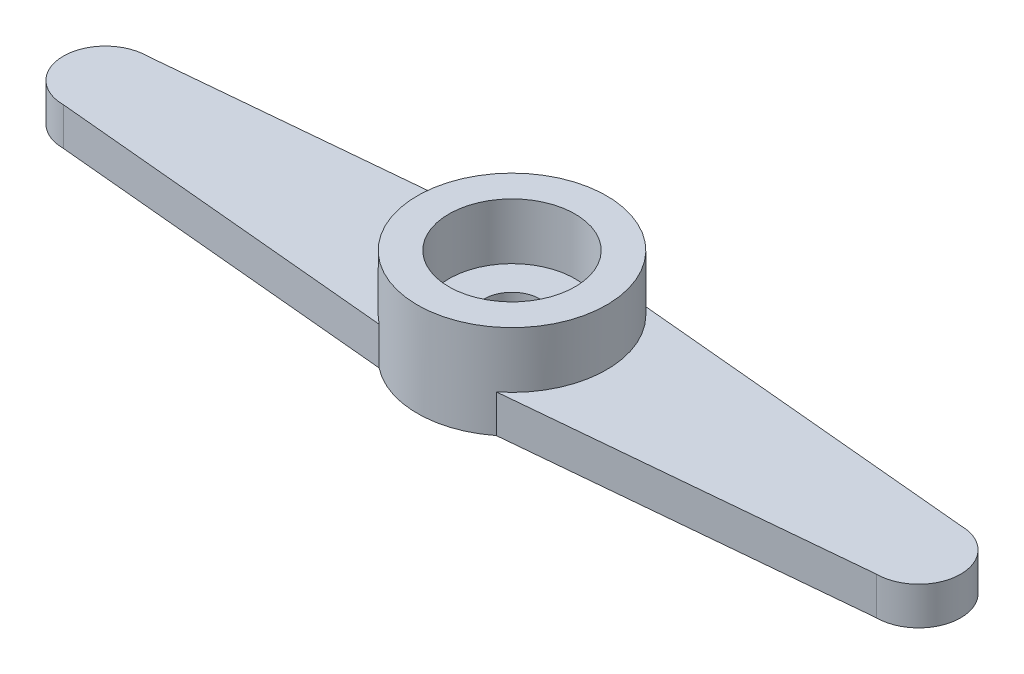
ISO-10303-21;
HEADER;
FILE_DESCRIPTION(('STEP AP214'),'2;1');
FILE_NAME('part.step','',(''),(''),'','','');
FILE_SCHEMA(('AUTOMOTIVE_DESIGN { 1 0 10303 214 1 1 1 1 }'));
ENDSEC;
DATA;
#1=APPLICATION_CONTEXT('core data for automotive mechanical design processes');
#2=APPLICATION_PROTOCOL_DEFINITION('international standard','automotive_design',2000,#1);
#3=PRODUCT_CONTEXT('',#1,'mechanical');
#4=PRODUCT('Part','Part','',(#3));
#5=PRODUCT_RELATED_PRODUCT_CATEGORY('part','',(#4));
#6=PRODUCT_DEFINITION_FORMATION('','',#4);
#7=PRODUCT_DEFINITION_CONTEXT('part definition',#1,'design');
#8=PRODUCT_DEFINITION('design','',#6,#7);
#9=PRODUCT_DEFINITION_SHAPE('','',#8);
#10=(LENGTH_UNIT() NAMED_UNIT(*) SI_UNIT(.MILLI.,.METRE.));
#11=(NAMED_UNIT(*) PLANE_ANGLE_UNIT() SI_UNIT($,.RADIAN.));
#12=(NAMED_UNIT(*) SI_UNIT($,.STERADIAN.) SOLID_ANGLE_UNIT());
#13=UNCERTAINTY_MEASURE_WITH_UNIT(LENGTH_MEASURE(1.E-05),#10,'distance_accuracy_value','');
#14=(GEOMETRIC_REPRESENTATION_CONTEXT(3) GLOBAL_UNCERTAINTY_ASSIGNED_CONTEXT((#13)) GLOBAL_UNIT_ASSIGNED_CONTEXT((#10,
#11,#12)) REPRESENTATION_CONTEXT('',''));
#15=CARTESIAN_POINT('',(0.,0.,0.));
#16=DIRECTION('',(0.,0.,1.));
#17=DIRECTION('',(1.,0.,0.));
#18=AXIS2_PLACEMENT_3D('',#15,#16,#17);
#19=CARTESIAN_POINT('',(0.,1.35,0.));
#20=DIRECTION('',(0.,1.,0.));
#21=DIRECTION('',(0.,0.,1.));
#22=AXIS2_PLACEMENT_3D('',#19,#20,#21);
#23=PLANE('',#22);
#24=CARTESIAN_POINT('',(0.,1.35,0.));
#25=DIRECTION('',(0.,1.,0.));
#26=DIRECTION('',(0.,0.,1.));
#27=AXIS2_PLACEMENT_3D('',#24,#25,#26);
#28=CIRCLE('',#27,3.375);
#29=CARTESIAN_POINT('',(2.09000598085269,1.35,2.65));
#30=VERTEX_POINT('',#29);
#31=CARTESIAN_POINT('',(2.09000598085269,1.35,-2.65));
#32=VERTEX_POINT('',#31);
#33=EDGE_CURVE('E50',#30,#32,#28,.T.);
#34=ORIENTED_EDGE('',*,*,#33,.F.);
#35=DIRECTION('',(0.995733846741475,0.,-0.0922719158434676));
#36=VECTOR('',#35,1.);
#37=CARTESIAN_POINT('',(0.26127194813818,1.35,2.81946375110068));
#38=LINE('',#37,#36);
#39=CARTESIAN_POINT('',(14.5,1.35,1.5));
#40=VERTEX_POINT('',#39);
#41=EDGE_CURVE('E128',#30,#40,#38,.T.);
#42=ORIENTED_EDGE('',*,*,#41,.T.);
#43=CARTESIAN_POINT('',(14.5,1.35,0.));
#44=DIRECTION('',(0.,1.,0.));
#45=DIRECTION('',(0.,0.,1.));
#46=AXIS2_PLACEMENT_3D('',#43,#44,#45);
#47=CIRCLE('',#46,1.5);
#48=CARTESIAN_POINT('',(14.5,1.35,-1.5));
#49=VERTEX_POINT('',#48);
#50=EDGE_CURVE('E114',#49,#40,#47,.F.);
#51=ORIENTED_EDGE('',*,*,#50,.F.);
#52=DIRECTION('',(0.995733846741475,0.,0.0922719158434676));
#53=VECTOR('',#52,1.);
#54=CARTESIAN_POINT('',(0.26127194813818,1.35,-2.81946375110068));
#55=LINE('',#54,#53);
#56=EDGE_CURVE('E126',#32,#49,#55,.T.);
#57=ORIENTED_EDGE('',*,*,#56,.F.);
#58=EDGE_LOOP('',(#34,#42,#51,#57));
#59=FACE_BOUND('',#58,.T.);
#60=ADVANCED_FACE('F39',(#59),#23,.T.);
#61=CARTESIAN_POINT('',(-0.26127194813818,1.35,-2.81946375110068));
#62=DIRECTION('',(0.0922719158434675,0.,0.995733846741475));
#63=DIRECTION('',(0.995733846741475,0.,-0.0922719158434676));
#64=AXIS2_PLACEMENT_3D('',#61,#62,#63);
#65=PLANE('',#64);
#66=DIRECTION('',(-0.995733846741475,0.,0.0922719158434676));
#67=VECTOR('',#66,1.);
#68=CARTESIAN_POINT('',(-0.26127194813818,0.,-2.81946375110068));
#69=LINE('',#68,#67);
#70=CARTESIAN_POINT('',(-2.09000598085269,0.,-2.65));
#71=VERTEX_POINT('',#70);
#72=CARTESIAN_POINT('',(-14.5,0.,-1.5));
#73=VERTEX_POINT('',#72);
#74=EDGE_CURVE('E137',#71,#73,#69,.T.);
#75=ORIENTED_EDGE('',*,*,#74,.T.);
#76=DIRECTION('',(0.,-1.,0.));
#77=VECTOR('',#76,1.);
#78=CARTESIAN_POINT('',(-14.5,1.35,-1.5));
#79=LINE('',#78,#77);
#80=CARTESIAN_POINT('',(-14.5,1.35,-1.5));
#81=VERTEX_POINT('',#80);
#82=EDGE_CURVE('E43',#81,#73,#79,.T.);
#83=ORIENTED_EDGE('',*,*,#82,.F.);
#84=DIRECTION('',(-0.995733846741475,0.,0.0922719158434676));
#85=VECTOR('',#84,1.);
#86=CARTESIAN_POINT('',(-0.26127194813818,1.35,-2.81946375110068));
#87=LINE('',#86,#85);
#88=CARTESIAN_POINT('',(-2.09000598085269,1.35,-2.65));
#89=VERTEX_POINT('',#88);
#90=EDGE_CURVE('E180',#89,#81,#87,.T.);
#91=ORIENTED_EDGE('',*,*,#90,.F.);
#92=DIRECTION('',(0.,-1.,0.));
#93=VECTOR('',#92,1.);
#94=CARTESIAN_POINT('',(-2.09000598085269,1.35,-2.65));
#95=LINE('',#94,#93);
#96=EDGE_CURVE('E132',#89,#71,#95,.T.);
#97=ORIENTED_EDGE('',*,*,#96,.T.);
#98=EDGE_LOOP('',(#75,#83,#91,#97));
#99=FACE_BOUND('',#98,.T.);
#100=ADVANCED_FACE('F41',(#99),#65,.F.);
#101=CARTESIAN_POINT('',(-14.5,1.35,0.));
#102=DIRECTION('',(0.,-1.,0.));
#103=DIRECTION('',(0.,0.,-1.));
#104=AXIS2_PLACEMENT_3D('',#101,#102,#103);
#105=CYLINDRICAL_SURFACE('',#104,1.5);
#106=CARTESIAN_POINT('',(-14.5,0.,0.));
#107=DIRECTION('',(0.,1.,0.));
#108=DIRECTION('',(0.,0.,1.));
#109=AXIS2_PLACEMENT_3D('',#106,#107,#108);
#110=CIRCLE('',#109,1.5);
#111=CARTESIAN_POINT('',(-14.5,0.,1.5));
#112=VERTEX_POINT('',#111);
#113=EDGE_CURVE('E140',#73,#112,#110,.T.);
#114=ORIENTED_EDGE('',*,*,#113,.T.);
#115=DIRECTION('',(0.,-1.,0.));
#116=VECTOR('',#115,1.);
#117=CARTESIAN_POINT('',(-14.5,1.35,1.5));
#118=LINE('',#117,#116);
#119=CARTESIAN_POINT('',(-14.5,1.35,1.5));
#120=VERTEX_POINT('',#119);
#121=EDGE_CURVE('E161',#120,#112,#118,.T.);
#122=ORIENTED_EDGE('',*,*,#121,.F.);
#123=CARTESIAN_POINT('',(-14.5,1.35,0.));
#124=DIRECTION('',(0.,1.,0.));
#125=DIRECTION('',(0.,0.,1.));
#126=AXIS2_PLACEMENT_3D('',#123,#124,#125);
#127=CIRCLE('',#126,1.5);
#128=EDGE_CURVE('E98',#81,#120,#127,.T.);
#129=ORIENTED_EDGE('',*,*,#128,.F.);
#130=ORIENTED_EDGE('',*,*,#82,.T.);
#131=EDGE_LOOP('',(#114,#122,#129,#130));
#132=FACE_BOUND('',#131,.T.);
#133=ADVANCED_FACE('F166',(#132),#105,.T.);
#134=CARTESIAN_POINT('',(-0.26127194813818,1.35,2.81946375110068));
#135=DIRECTION('',(-0.0922719158434675,0.,0.995733846741475));
#136=DIRECTION('',(0.995733846741475,0.,0.0922719158434676));
#137=AXIS2_PLACEMENT_3D('',#134,#135,#136);
#138=PLANE('',#137);
#139=DIRECTION('',(-0.995733846741475,0.,-0.0922719158434676));
#140=VECTOR('',#139,1.);
#141=CARTESIAN_POINT('',(-0.26127194813818,0.,2.81946375110068));
#142=LINE('',#141,#140);
#143=CARTESIAN_POINT('',(-2.09000598085269,0.,2.65));
#144=VERTEX_POINT('',#143);
#145=EDGE_CURVE('E144',#144,#112,#142,.T.);
#146=ORIENTED_EDGE('',*,*,#145,.F.);
#147=DIRECTION('',(0.,-1.,0.));
#148=VECTOR('',#147,1.);
#149=CARTESIAN_POINT('',(-2.09000598085269,1.35,2.65));
#150=LINE('',#149,#148);
#151=CARTESIAN_POINT('',(-2.09000598085269,1.35,2.65));
#152=VERTEX_POINT('',#151);
#153=EDGE_CURVE('E160',#152,#144,#150,.T.);
#154=ORIENTED_EDGE('',*,*,#153,.F.);
#155=DIRECTION('',(-0.995733846741475,0.,-0.0922719158434676));
#156=VECTOR('',#155,1.);
#157=CARTESIAN_POINT('',(-0.26127194813818,1.35,2.81946375110068));
#158=LINE('',#157,#156);
#159=EDGE_CURVE('E175',#152,#120,#158,.T.);
#160=ORIENTED_EDGE('',*,*,#159,.T.);
#161=ORIENTED_EDGE('',*,*,#121,.T.);
#162=EDGE_LOOP('',(#146,#154,#160,#161));
#163=FACE_BOUND('',#162,.T.);
#164=ADVANCED_FACE('F174',(#163),#138,.T.);
#165=CARTESIAN_POINT('',(0.26127194813818,1.35,2.81946375110068));
#166=DIRECTION('',(-0.0922719158434675,0.,-0.995733846741475));
#167=DIRECTION('',(-0.995733846741475,0.,0.0922719158434676));
#168=AXIS2_PLACEMENT_3D('',#165,#166,#167);
#169=PLANE('',#168);
#170=DIRECTION('',(0.995733846741475,0.,-0.0922719158434676));
#171=VECTOR('',#170,1.);
#172=CARTESIAN_POINT('',(0.26127194813818,0.,2.81946375110068));
#173=LINE('',#172,#171);
#174=CARTESIAN_POINT('',(2.09000598085269,0.,2.65));
#175=VERTEX_POINT('',#174);
#176=CARTESIAN_POINT('',(14.5,0.,1.5));
#177=VERTEX_POINT('',#176);
#178=EDGE_CURVE('E149',#175,#177,#173,.T.);
#179=ORIENTED_EDGE('',*,*,#178,.T.);
#180=DIRECTION('',(0.,-1.,0.));
#181=VECTOR('',#180,1.);
#182=CARTESIAN_POINT('',(14.5,1.35,1.5));
#183=LINE('',#182,#181);
#184=EDGE_CURVE('E121',#40,#177,#183,.T.);
#185=ORIENTED_EDGE('',*,*,#184,.F.);
#186=ORIENTED_EDGE('',*,*,#41,.F.);
#187=DIRECTION('',(0.,-1.,0.));
#188=VECTOR('',#187,1.);
#189=CARTESIAN_POINT('',(2.09000598085269,1.35,2.65));
#190=LINE('',#189,#188);
#191=EDGE_CURVE('E157',#30,#175,#190,.T.);
#192=ORIENTED_EDGE('',*,*,#191,.T.);
#193=EDGE_LOOP('',(#179,#185,#186,#192));
#194=FACE_BOUND('',#193,.T.);
#195=ADVANCED_FACE('F321',(#194),#169,.F.);
#196=CARTESIAN_POINT('',(14.5,1.35,0.));
#197=DIRECTION('',(0.,-1.,0.));
#198=DIRECTION('',(0.,0.,-1.));
#199=AXIS2_PLACEMENT_3D('',#196,#197,#198);
#200=CYLINDRICAL_SURFACE('',#199,1.5);
#201=CARTESIAN_POINT('',(14.5,0.,0.));
#202=DIRECTION('',(0.,1.,0.));
#203=DIRECTION('',(0.,0.,1.));
#204=AXIS2_PLACEMENT_3D('',#201,#202,#203);
#205=CIRCLE('',#204,1.5);
#206=CARTESIAN_POINT('',(14.5,0.,-1.5));
#207=VERTEX_POINT('',#206);
#208=EDGE_CURVE('E116',#207,#177,#205,.F.);
#209=ORIENTED_EDGE('',*,*,#208,.F.);
#210=DIRECTION('',(0.,-1.,0.));
#211=VECTOR('',#210,1.);
#212=CARTESIAN_POINT('',(14.5,1.35,-1.5));
#213=LINE('',#212,#211);
#214=EDGE_CURVE('E111',#49,#207,#213,.T.);
#215=ORIENTED_EDGE('',*,*,#214,.F.);
#216=ORIENTED_EDGE('',*,*,#50,.T.);
#217=ORIENTED_EDGE('',*,*,#184,.T.);
#218=EDGE_LOOP('',(#209,#215,#216,#217));
#219=FACE_BOUND('',#218,.T.);
#220=ADVANCED_FACE('F113',(#219),#200,.T.);
#221=CARTESIAN_POINT('',(0.26127194813818,1.35,-2.81946375110068));
#222=DIRECTION('',(0.0922719158434675,0.,-0.995733846741475));
#223=DIRECTION('',(-0.995733846741475,0.,-0.0922719158434676));
#224=AXIS2_PLACEMENT_3D('',#221,#222,#223);
#225=PLANE('',#224);
#226=DIRECTION('',(0.995733846741475,0.,0.0922719158434676));
#227=VECTOR('',#226,1.);
#228=CARTESIAN_POINT('',(0.26127194813818,0.,-2.81946375110068));
#229=LINE('',#228,#227);
#230=CARTESIAN_POINT('',(2.09000598085269,0.,-2.65));
#231=VERTEX_POINT('',#230);
#232=EDGE_CURVE('E153',#231,#207,#229,.T.);
#233=ORIENTED_EDGE('',*,*,#232,.F.);
#234=DIRECTION('',(0.,-1.,0.));
#235=VECTOR('',#234,1.);
#236=CARTESIAN_POINT('',(2.09000598085269,1.35,-2.65));
#237=LINE('',#236,#235);
#238=EDGE_CURVE('E86',#32,#231,#237,.T.);
#239=ORIENTED_EDGE('',*,*,#238,.F.);
#240=ORIENTED_EDGE('',*,*,#56,.T.);
#241=ORIENTED_EDGE('',*,*,#214,.T.);
#242=EDGE_LOOP('',(#233,#239,#240,#241));
#243=FACE_BOUND('',#242,.T.);
#244=ADVANCED_FACE('F131',(#243),#225,.T.);
#245=CARTESIAN_POINT('',(0.,1.35,0.));
#246=DIRECTION('',(0.,-1.,0.));
#247=DIRECTION('',(0.,0.,-1.));
#248=AXIS2_PLACEMENT_3D('',#245,#246,#247);
#249=CYLINDRICAL_SURFACE('',#248,3.375);
#250=CARTESIAN_POINT('',(0.,0.,0.));
#251=DIRECTION('',(0.,1.,0.));
#252=DIRECTION('',(0.,0.,1.));
#253=AXIS2_PLACEMENT_3D('',#250,#251,#252);
#254=CIRCLE('',#253,3.375);
#255=EDGE_CURVE('E89',#231,#71,#254,.T.);
#256=ORIENTED_EDGE('',*,*,#255,.T.);
#257=ORIENTED_EDGE('',*,*,#96,.F.);
#258=EDGE_CURVE('E11',#89,#152,#28,.T.);
#259=ORIENTED_EDGE('',*,*,#258,.T.);
#260=ORIENTED_EDGE('',*,*,#153,.T.);
#261=EDGE_CURVE('E147',#144,#175,#254,.T.);
#262=ORIENTED_EDGE('',*,*,#261,.T.);
#263=ORIENTED_EDGE('',*,*,#191,.F.);
#264=ORIENTED_EDGE('',*,*,#33,.T.);
#265=ORIENTED_EDGE('',*,*,#238,.T.);
#266=EDGE_LOOP('',(#256,#257,#259,#260,#262,#263,#264,#265));
#267=FACE_BOUND('',#266,.T.);
#268=CARTESIAN_POINT('',(0.,3.35,0.));
#269=DIRECTION('',(0.,1.,0.));
#270=DIRECTION('',(0.,0.,1.));
#271=AXIS2_PLACEMENT_3D('',#268,#269,#270);
#272=CIRCLE('',#271,3.375);
#273=CARTESIAN_POINT('',(0.,3.35,3.375));
#274=VERTEX_POINT('',#273);
#275=EDGE_CURVE('E141',#274,#274,#272,.T.);
#276=ORIENTED_EDGE('',*,*,#275,.F.);
#277=EDGE_LOOP('',(#276));
#278=FACE_BOUND('',#277,.T.);
#279=ADVANCED_FACE('F178',(#267,#278),#249,.T.);
#280=ORIENTED_EDGE('',*,*,#258,.F.);
#281=ORIENTED_EDGE('',*,*,#90,.T.);
#282=ORIENTED_EDGE('',*,*,#128,.T.);
#283=ORIENTED_EDGE('',*,*,#159,.F.);
#284=EDGE_LOOP('',(#280,#281,#282,#283));
#285=FACE_BOUND('',#284,.T.);
#286=ADVANCED_FACE('F176',(#285),#23,.T.);
#287=CARTESIAN_POINT('',(0.,0.,0.));
#288=DIRECTION('',(0.,1.,0.));
#289=DIRECTION('',(0.,0.,1.));
#290=AXIS2_PLACEMENT_3D('',#287,#288,#289);
#291=PLANE('',#290);
#292=CARTESIAN_POINT('',(0.,0.,0.));
#293=DIRECTION('',(0.,1.,0.));
#294=DIRECTION('',(0.,0.,1.));
#295=AXIS2_PLACEMENT_3D('',#292,#293,#294);
#296=CIRCLE('',#295,1.);
#297=CARTESIAN_POINT('',(0.,0.,1.));
#298=VERTEX_POINT('',#297);
#299=EDGE_CURVE('E190',#298,#298,#296,.T.);
#300=ORIENTED_EDGE('',*,*,#299,.T.);
#301=EDGE_LOOP('',(#300));
#302=FACE_BOUND('',#301,.T.);
#303=ORIENTED_EDGE('',*,*,#74,.F.);
#304=ORIENTED_EDGE('',*,*,#255,.F.);
#305=ORIENTED_EDGE('',*,*,#232,.T.);
#306=ORIENTED_EDGE('',*,*,#208,.T.);
#307=ORIENTED_EDGE('',*,*,#178,.F.);
#308=ORIENTED_EDGE('',*,*,#261,.F.);
#309=ORIENTED_EDGE('',*,*,#145,.T.);
#310=ORIENTED_EDGE('',*,*,#113,.F.);
#311=EDGE_LOOP('',(#303,#304,#305,#306,#307,#308,#309,#310));
#312=FACE_BOUND('',#311,.T.);
#313=ADVANCED_FACE('F171',(#302,#312),#291,.F.);
#314=CARTESIAN_POINT('',(0.,3.35,0.));
#315=DIRECTION('',(0.,1.,0.));
#316=DIRECTION('',(0.,0.,1.));
#317=AXIS2_PLACEMENT_3D('',#314,#315,#316);
#318=PLANE('',#317);
#319=CARTESIAN_POINT('',(0.,3.35,0.));
#320=DIRECTION('',(0.,1.,0.));
#321=DIRECTION('',(0.,0.,1.));
#322=AXIS2_PLACEMENT_3D('',#319,#320,#321);
#323=CIRCLE('',#322,2.25);
#324=CARTESIAN_POINT('',(0.,3.35,2.25));
#325=VERTEX_POINT('',#324);
#326=EDGE_CURVE('E187',#325,#325,#323,.T.);
#327=ORIENTED_EDGE('',*,*,#326,.F.);
#328=EDGE_LOOP('',(#327));
#329=FACE_BOUND('',#328,.T.);
#330=ORIENTED_EDGE('',*,*,#275,.T.);
#331=EDGE_LOOP('',(#330));
#332=FACE_BOUND('',#331,.T.);
#333=ADVANCED_FACE('F215',(#329,#332),#318,.T.);
#334=CARTESIAN_POINT('',(0.,1.35,0.));
#335=DIRECTION('',(0.,1.,0.));
#336=DIRECTION('',(0.,0.,1.));
#337=AXIS2_PLACEMENT_3D('',#334,#335,#336);
#338=CYLINDRICAL_SURFACE('',#337,2.25);
#339=CARTESIAN_POINT('',(0.,1.35,0.));
#340=DIRECTION('',(0.,1.,0.));
#341=DIRECTION('',(0.,0.,1.));
#342=AXIS2_PLACEMENT_3D('',#339,#340,#341);
#343=CIRCLE('',#342,2.25);
#344=CARTESIAN_POINT('',(0.,1.35,2.25));
#345=VERTEX_POINT('',#344);
#346=EDGE_CURVE('E184',#345,#345,#343,.T.);
#347=ORIENTED_EDGE('',*,*,#346,.F.);
#348=EDGE_LOOP('',(#347));
#349=FACE_BOUND('',#348,.T.);
#350=ORIENTED_EDGE('',*,*,#326,.T.);
#351=EDGE_LOOP('',(#350));
#352=FACE_BOUND('',#351,.T.);
#353=ADVANCED_FACE('F209',(#349,#352),#338,.F.);
#354=CARTESIAN_POINT('',(0.,1.35,0.));
#355=DIRECTION('',(0.,1.,0.));
#356=DIRECTION('',(0.,0.,1.));
#357=AXIS2_PLACEMENT_3D('',#354,#355,#356);
#358=PLANE('',#357);
#359=CARTESIAN_POINT('',(0.,1.35,0.));
#360=DIRECTION('',(0.,1.,0.));
#361=DIRECTION('',(0.,0.,1.));
#362=AXIS2_PLACEMENT_3D('',#359,#360,#361);
#363=CIRCLE('',#362,1.);
#364=CARTESIAN_POINT('',(0.,1.35,1.));
#365=VERTEX_POINT('',#364);
#366=EDGE_CURVE('E193',#365,#365,#363,.T.);
#367=ORIENTED_EDGE('',*,*,#366,.F.);
#368=EDGE_LOOP('',(#367));
#369=FACE_BOUND('',#368,.T.);
#370=ORIENTED_EDGE('',*,*,#346,.T.);
#371=EDGE_LOOP('',(#370));
#372=FACE_BOUND('',#371,.T.);
#373=ADVANCED_FACE('F203',(#369,#372),#358,.T.);
#374=CARTESIAN_POINT('',(0.,0.,0.));
#375=DIRECTION('',(0.,1.,0.));
#376=DIRECTION('',(0.,0.,1.));
#377=AXIS2_PLACEMENT_3D('',#374,#375,#376);
#378=CYLINDRICAL_SURFACE('',#377,1.);
#379=CARTESIAN_POINT('',(0.,0.,1.));
#380=CARTESIAN_POINT('',(0.,0.0140625,1.));
#381=CARTESIAN_POINT('',(0.,0.028125,1.));
#382=CARTESIAN_POINT('',(0.,0.05625,1.));
#383=CARTESIAN_POINT('',(0.,0.0703125,1.));
#384=CARTESIAN_POINT('',(0.,0.0984375,1.));
#385=CARTESIAN_POINT('',(0.,0.1125,1.));
#386=CARTESIAN_POINT('',(0.,0.140625,1.));
#387=CARTESIAN_POINT('',(0.,0.1546875,1.));
#388=CARTESIAN_POINT('',(0.,0.1828125,1.));
#389=CARTESIAN_POINT('',(0.,0.196875,1.));
#390=CARTESIAN_POINT('',(0.,0.225,1.));
#391=CARTESIAN_POINT('',(0.,0.2390625,1.));
#392=CARTESIAN_POINT('',(0.,0.2671875,1.));
#393=CARTESIAN_POINT('',(0.,0.28125,1.));
#394=CARTESIAN_POINT('',(0.,0.309375,1.));
#395=CARTESIAN_POINT('',(0.,0.3234375,1.));
#396=CARTESIAN_POINT('',(0.,0.3515625,1.));
#397=CARTESIAN_POINT('',(0.,0.365625,1.));
#398=CARTESIAN_POINT('',(0.,0.39375,1.));
#399=CARTESIAN_POINT('',(0.,0.4078125,1.));
#400=CARTESIAN_POINT('',(0.,0.4359375,1.));
#401=CARTESIAN_POINT('',(0.,0.45,1.));
#402=CARTESIAN_POINT('',(0.,0.478125,1.));
#403=CARTESIAN_POINT('',(0.,0.4921875,1.));
#404=CARTESIAN_POINT('',(0.,0.5203125,1.));
#405=CARTESIAN_POINT('',(0.,0.534375,1.));
#406=CARTESIAN_POINT('',(0.,0.5625,1.));
#407=CARTESIAN_POINT('',(0.,0.5765625,1.));
#408=CARTESIAN_POINT('',(0.,0.6046875,1.));
#409=CARTESIAN_POINT('',(0.,0.61875,1.));
#410=CARTESIAN_POINT('',(0.,0.646875,1.));
#411=CARTESIAN_POINT('',(0.,0.6609375,1.));
#412=CARTESIAN_POINT('',(0.,0.6890625,1.));
#413=CARTESIAN_POINT('',(0.,0.703125,1.));
#414=CARTESIAN_POINT('',(0.,0.73125,1.));
#415=CARTESIAN_POINT('',(0.,0.7453125,1.));
#416=CARTESIAN_POINT('',(0.,0.7734375,1.));
#417=CARTESIAN_POINT('',(0.,0.7875,1.));
#418=CARTESIAN_POINT('',(0.,0.815625,1.));
#419=CARTESIAN_POINT('',(0.,0.8296875,1.));
#420=CARTESIAN_POINT('',(0.,0.8578125,1.));
#421=CARTESIAN_POINT('',(0.,0.871875,1.));
#422=CARTESIAN_POINT('',(0.,0.9,1.));
#423=CARTESIAN_POINT('',(0.,0.9140625,1.));
#424=CARTESIAN_POINT('',(0.,0.9421875,1.));
#425=CARTESIAN_POINT('',(0.,0.95625,1.));
#426=CARTESIAN_POINT('',(0.,0.984375,1.));
#427=CARTESIAN_POINT('',(0.,0.9984375,1.));
#428=CARTESIAN_POINT('',(0.,1.0265625,1.));
#429=CARTESIAN_POINT('',(0.,1.040625,1.));
#430=CARTESIAN_POINT('',(0.,1.06875,1.));
#431=CARTESIAN_POINT('',(0.,1.0828125,1.));
#432=CARTESIAN_POINT('',(0.,1.1109375,1.));
#433=CARTESIAN_POINT('',(0.,1.125,1.));
#434=CARTESIAN_POINT('',(0.,1.153125,1.));
#435=CARTESIAN_POINT('',(0.,1.1671875,1.));
#436=CARTESIAN_POINT('',(0.,1.1953125,1.));
#437=CARTESIAN_POINT('',(0.,1.209375,1.));
#438=CARTESIAN_POINT('',(0.,1.2375,1.));
#439=CARTESIAN_POINT('',(0.,1.2515625,1.));
#440=CARTESIAN_POINT('',(0.,1.2796875,1.));
#441=CARTESIAN_POINT('',(0.,1.29375,1.));
#442=CARTESIAN_POINT('',(0.,1.321875,1.));
#443=CARTESIAN_POINT('',(0.,1.3359375,1.));
#444=CARTESIAN_POINT('',(0.,1.35,1.));
#445=B_SPLINE_CURVE_WITH_KNOTS('',3,(#379,#380,#381,#382,#383,#384,#385,#386,#387,#388,#389,
#390,#391,#392,#393,#394,#395,#396,#397,#398,#399,#400,#401,#402,#403,#404,#405,#406,#407,#408,
#409,#410,#411,#412,#413,#414,#415,#416,#417,#418,#419,#420,#421,#422,#423,#424,#425,#426,#427,
#428,#429,#430,#431,#432,#433,#434,#435,#436,#437,#438,#439,#440,#441,#442,#443,#444),
.UNSPECIFIED.,.F.,.F.,(4,2,2,2,2,2,2,2,2,2,2,2,2,2,2,2,2,2,2,2,2,2,2,2,2,2,2,2,2,2,2,2,4),(0.,
0.0421875,0.084375,0.1265625,0.16875,0.2109375,0.253125,0.2953125,0.3375,0.3796875,0.421875,
0.4640625,0.50625,0.5484375,0.590625,0.6328125,0.675,0.7171875,0.759375,0.8015625,0.84375,
0.8859375,0.928125,0.9703125,1.0125,1.0546875,1.096875,1.1390625,1.18125,1.2234375,1.265625,
1.3078125,1.35),.UNSPECIFIED.);
#446=EDGE_CURVE('BSEAM200',#298,#365,#445,.T.);
#447=ORIENTED_EDGE('',*,*,#299,.F.);
#448=ORIENTED_EDGE('',*,*,#366,.T.);
#449=ORIENTED_EDGE('',*,*,#446,.T.);
#450=ORIENTED_EDGE('',*,*,#446,.F.);
#451=EDGE_LOOP('',(#447,#449,#448,#450));
#452=FACE_BOUND('',#451,.T.);
#453=ADVANCED_FACE('F200',(#452),#378,.F.);
#454=CLOSED_SHELL('',(#60,#100,#133,#164,#195,#220,#244,#279,#286,#313,#333,#353,#373,#453));
#455=MANIFOLD_SOLID_BREP('B2',#454);
#456=ADVANCED_BREP_SHAPE_REPRESENTATION('',(#18,#455),#14);
#457=SHAPE_DEFINITION_REPRESENTATION(#9,#456);
ENDSEC;
END-ISO-10303-21;
